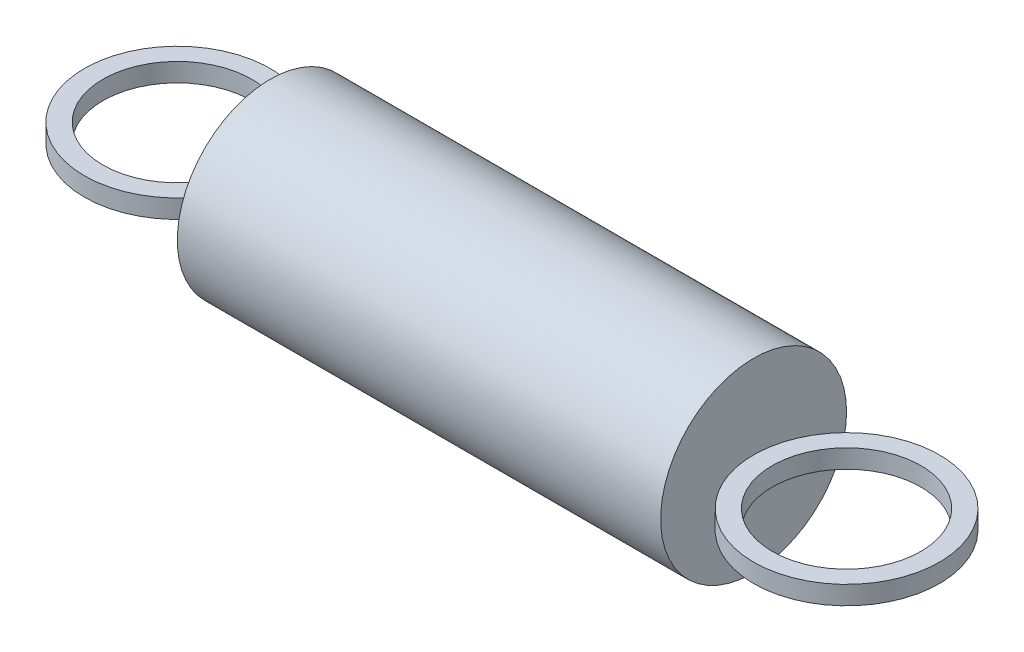
ISO-10303-21;
HEADER;
FILE_DESCRIPTION(('STEP AP214'),'2;1');
FILE_NAME('part.step','',(''),(''),'','','');
FILE_SCHEMA(('AUTOMOTIVE_DESIGN { 1 0 10303 214 1 1 1 1 }'));
ENDSEC;
DATA;
#1=APPLICATION_CONTEXT('core data for automotive mechanical design processes');
#2=APPLICATION_PROTOCOL_DEFINITION('international standard','automotive_design',2000,#1);
#3=PRODUCT_CONTEXT('',#1,'mechanical');
#4=PRODUCT('Part','Part','',(#3));
#5=PRODUCT_RELATED_PRODUCT_CATEGORY('part','',(#4));
#6=PRODUCT_DEFINITION_FORMATION('','',#4);
#7=PRODUCT_DEFINITION_CONTEXT('part definition',#1,'design');
#8=PRODUCT_DEFINITION('design','',#6,#7);
#9=PRODUCT_DEFINITION_SHAPE('','',#8);
#10=(LENGTH_UNIT() NAMED_UNIT(*) SI_UNIT(.MILLI.,.METRE.));
#11=(NAMED_UNIT(*) PLANE_ANGLE_UNIT() SI_UNIT($,.RADIAN.));
#12=(NAMED_UNIT(*) SI_UNIT($,.STERADIAN.) SOLID_ANGLE_UNIT());
#13=UNCERTAINTY_MEASURE_WITH_UNIT(LENGTH_MEASURE(1.E-05),#10,'distance_accuracy_value','');
#14=(GEOMETRIC_REPRESENTATION_CONTEXT(3) GLOBAL_UNCERTAINTY_ASSIGNED_CONTEXT((#13)) GLOBAL_UNIT_ASSIGNED_CONTEXT((#10,
#11,#12)) REPRESENTATION_CONTEXT('',''));
#15=CARTESIAN_POINT('',(0.,0.,0.));
#16=DIRECTION('',(0.,0.,1.));
#17=DIRECTION('',(1.,0.,0.));
#18=AXIS2_PLACEMENT_3D('',#15,#16,#17);
#19=CARTESIAN_POINT('',(24.60625,0.396875,0.));
#20=DIRECTION('',(0.,1.,0.));
#21=DIRECTION('',(0.,0.,1.));
#22=AXIS2_PLACEMENT_3D('',#19,#20,#21);
#23=PLANE('',#22);
#24=CARTESIAN_POINT('',(24.60625,0.396875,0.));
#25=DIRECTION('',(0.,1.,0.));
#26=DIRECTION('',(0.,0.,1.));
#27=AXIS2_PLACEMENT_3D('',#24,#25,#26);
#28=CIRCLE('',#27,3.96875);
#29=CARTESIAN_POINT('',(24.60625,0.396875,3.96875));
#30=VERTEX_POINT('',#29);
#31=EDGE_CURVE('E11',#30,#30,#28,.T.);
#32=ORIENTED_EDGE('',*,*,#31,.T.);
#33=EDGE_LOOP('',(#32));
#34=FACE_BOUND('',#33,.T.);
#35=CARTESIAN_POINT('',(24.60625,0.396875,0.));
#36=DIRECTION('',(0.,1.,0.));
#37=DIRECTION('',(0.,0.,1.));
#38=AXIS2_PLACEMENT_3D('',#35,#36,#37);
#39=CIRCLE('',#38,3.17500000000001);
#40=CARTESIAN_POINT('',(24.60625,0.396875,3.17500000000001));
#41=VERTEX_POINT('',#40);
#42=EDGE_CURVE('E50',#41,#41,#39,.T.);
#43=ORIENTED_EDGE('',*,*,#42,.F.);
#44=EDGE_LOOP('',(#43));
#45=FACE_BOUND('',#44,.T.);
#46=ADVANCED_FACE('F39',(#34,#45),#23,.T.);
#47=CARTESIAN_POINT('',(24.60625,-0.396875,0.));
#48=DIRECTION('',(0.,1.,0.));
#49=DIRECTION('',(0.,0.,1.));
#50=AXIS2_PLACEMENT_3D('',#47,#48,#49);
#51=PLANE('',#50);
#52=CARTESIAN_POINT('',(24.60625,-0.396875,0.));
#53=DIRECTION('',(0.,1.,0.));
#54=DIRECTION('',(0.,0.,1.));
#55=AXIS2_PLACEMENT_3D('',#52,#53,#54);
#56=CIRCLE('',#55,3.96875);
#57=CARTESIAN_POINT('',(24.60625,-0.396875,3.96875));
#58=VERTEX_POINT('',#57);
#59=EDGE_CURVE('E43',#58,#58,#56,.T.);
#60=ORIENTED_EDGE('',*,*,#59,.F.);
#61=EDGE_LOOP('',(#60));
#62=FACE_BOUND('',#61,.T.);
#63=CARTESIAN_POINT('',(24.60625,-0.396875,0.));
#64=DIRECTION('',(0.,1.,0.));
#65=DIRECTION('',(0.,0.,1.));
#66=AXIS2_PLACEMENT_3D('',#63,#64,#65);
#67=CIRCLE('',#66,3.17500000000001);
#68=CARTESIAN_POINT('',(24.60625,-0.396875,3.17500000000001));
#69=VERTEX_POINT('',#68);
#70=EDGE_CURVE('E52',#69,#69,#67,.T.);
#71=ORIENTED_EDGE('',*,*,#70,.T.);
#72=EDGE_LOOP('',(#71));
#73=FACE_BOUND('',#72,.T.);
#74=ADVANCED_FACE('F62',(#62,#73),#51,.F.);
#75=CARTESIAN_POINT('',(24.60625,0.396875,0.));
#76=DIRECTION('',(0.,-1.,0.));
#77=DIRECTION('',(0.,0.,-1.));
#78=AXIS2_PLACEMENT_3D('',#75,#76,#77);
#79=CYLINDRICAL_SURFACE('',#78,3.96875);
#80=ORIENTED_EDGE('',*,*,#31,.F.);
#81=EDGE_LOOP('',(#80));
#82=FACE_BOUND('',#81,.T.);
#83=ORIENTED_EDGE('',*,*,#59,.T.);
#84=EDGE_LOOP('',(#83));
#85=FACE_BOUND('',#84,.T.);
#86=ADVANCED_FACE('F41',(#82,#85),#79,.T.);
#87=CARTESIAN_POINT('',(24.60625,0.396875,0.));
#88=DIRECTION('',(0.,-1.,0.));
#89=DIRECTION('',(0.,0.,-1.));
#90=AXIS2_PLACEMENT_3D('',#87,#88,#89);
#91=CYLINDRICAL_SURFACE('',#90,3.17500000000001);
#92=ORIENTED_EDGE('',*,*,#42,.T.);
#93=EDGE_LOOP('',(#92));
#94=FACE_BOUND('',#93,.T.);
#95=ORIENTED_EDGE('',*,*,#70,.F.);
#96=EDGE_LOOP('',(#95));
#97=FACE_BOUND('',#96,.T.);
#98=ADVANCED_FACE('F58',(#94,#97),#91,.F.);
#99=CLOSED_SHELL('',(#46,#74,#86,#98));
#100=MANIFOLD_SOLID_BREP('B2',#99);
#101=CARTESIAN_POINT('',(-3.96875,0.396875,0.));
#102=DIRECTION('',(0.,1.,0.));
#103=DIRECTION('',(0.,0.,1.));
#104=AXIS2_PLACEMENT_3D('',#101,#102,#103);
#105=PLANE('',#104);
#106=CARTESIAN_POINT('',(-3.96875,0.396875,0.));
#107=DIRECTION('',(0.,1.,0.));
#108=DIRECTION('',(0.,0.,1.));
#109=AXIS2_PLACEMENT_3D('',#106,#107,#108);
#110=CIRCLE('',#109,3.96875);
#111=CARTESIAN_POINT('',(-3.96875,0.396875,3.96875));
#112=VERTEX_POINT('',#111);
#113=EDGE_CURVE('E38',#112,#112,#110,.T.);
#114=ORIENTED_EDGE('',*,*,#113,.T.);
#115=EDGE_LOOP('',(#114));
#116=FACE_BOUND('',#115,.T.);
#117=CARTESIAN_POINT('',(-3.96875,0.396875,0.));
#118=DIRECTION('',(0.,1.,0.));
#119=DIRECTION('',(0.,0.,1.));
#120=AXIS2_PLACEMENT_3D('',#117,#118,#119);
#121=CIRCLE('',#120,3.175);
#122=CARTESIAN_POINT('',(-3.96875,0.396875,3.175));
#123=VERTEX_POINT('',#122);
#124=EDGE_CURVE('E118',#123,#123,#121,.T.);
#125=ORIENTED_EDGE('',*,*,#124,.F.);
#126=EDGE_LOOP('',(#125));
#127=FACE_BOUND('',#126,.T.);
#128=ADVANCED_FACE('F107',(#116,#127),#105,.T.);
#129=CARTESIAN_POINT('',(-3.96875,-0.396875,0.));
#130=DIRECTION('',(0.,1.,0.));
#131=DIRECTION('',(0.,0.,1.));
#132=AXIS2_PLACEMENT_3D('',#129,#130,#131);
#133=PLANE('',#132);
#134=CARTESIAN_POINT('',(-3.96875,-0.396875,0.));
#135=DIRECTION('',(0.,1.,0.));
#136=DIRECTION('',(0.,0.,1.));
#137=AXIS2_PLACEMENT_3D('',#134,#135,#136);
#138=CIRCLE('',#137,3.96875);
#139=CARTESIAN_POINT('',(-3.96875,-0.396875,3.96875));
#140=VERTEX_POINT('',#139);
#141=EDGE_CURVE('E111',#140,#140,#138,.T.);
#142=ORIENTED_EDGE('',*,*,#141,.F.);
#143=EDGE_LOOP('',(#142));
#144=FACE_BOUND('',#143,.T.);
#145=CARTESIAN_POINT('',(-3.96875,-0.396875,0.));
#146=DIRECTION('',(0.,1.,0.));
#147=DIRECTION('',(0.,0.,1.));
#148=AXIS2_PLACEMENT_3D('',#145,#146,#147);
#149=CIRCLE('',#148,3.175);
#150=CARTESIAN_POINT('',(-3.96875,-0.396875,3.175));
#151=VERTEX_POINT('',#150);
#152=EDGE_CURVE('E120',#151,#151,#149,.T.);
#153=ORIENTED_EDGE('',*,*,#152,.T.);
#154=EDGE_LOOP('',(#153));
#155=FACE_BOUND('',#154,.T.);
#156=ADVANCED_FACE('F130',(#144,#155),#133,.F.);
#157=CARTESIAN_POINT('',(-3.96875,0.396875,0.));
#158=DIRECTION('',(0.,-1.,0.));
#159=DIRECTION('',(0.,0.,-1.));
#160=AXIS2_PLACEMENT_3D('',#157,#158,#159);
#161=CYLINDRICAL_SURFACE('',#160,3.96875);
#162=ORIENTED_EDGE('',*,*,#113,.F.);
#163=EDGE_LOOP('',(#162));
#164=FACE_BOUND('',#163,.T.);
#165=ORIENTED_EDGE('',*,*,#141,.T.);
#166=EDGE_LOOP('',(#165));
#167=FACE_BOUND('',#166,.T.);
#168=ADVANCED_FACE('F109',(#164,#167),#161,.T.);
#169=CARTESIAN_POINT('',(-3.96875,0.396875,0.));
#170=DIRECTION('',(0.,-1.,0.));
#171=DIRECTION('',(0.,0.,-1.));
#172=AXIS2_PLACEMENT_3D('',#169,#170,#171);
#173=CYLINDRICAL_SURFACE('',#172,3.175);
#174=ORIENTED_EDGE('',*,*,#124,.T.);
#175=EDGE_LOOP('',(#174));
#176=FACE_BOUND('',#175,.T.);
#177=ORIENTED_EDGE('',*,*,#152,.F.);
#178=EDGE_LOOP('',(#177));
#179=FACE_BOUND('',#178,.T.);
#180=ADVANCED_FACE('F126',(#176,#179),#173,.F.);
#181=CLOSED_SHELL('',(#128,#156,#168,#180));
#182=MANIFOLD_SOLID_BREP('B6',#181);
#183=CARTESIAN_POINT('',(20.6375,0.,0.));
#184=DIRECTION('',(-1.,0.,0.));
#185=DIRECTION('',(0.,0.,1.));
#186=AXIS2_PLACEMENT_3D('',#183,#184,#185);
#187=CYLINDRICAL_SURFACE('',#186,3.96875);
#188=CARTESIAN_POINT('',(20.6375,0.,0.));
#189=DIRECTION('',(1.,0.,0.));
#190=DIRECTION('',(0.,0.,-1.));
#191=AXIS2_PLACEMENT_3D('',#188,#189,#190);
#192=CIRCLE('',#191,3.96875);
#193=CARTESIAN_POINT('',(20.6375,0.,-3.96875));
#194=VERTEX_POINT('',#193);
#195=EDGE_CURVE('E106',#194,#194,#192,.T.);
#196=ORIENTED_EDGE('',*,*,#195,.F.);
#197=EDGE_LOOP('',(#196));
#198=FACE_BOUND('',#197,.T.);
#199=CARTESIAN_POINT('',(0.,0.,0.));
#200=DIRECTION('',(1.,0.,0.));
#201=DIRECTION('',(0.,0.,-1.));
#202=AXIS2_PLACEMENT_3D('',#199,#200,#201);
#203=CIRCLE('',#202,3.96875);
#204=CARTESIAN_POINT('',(0.,0.,-3.96875));
#205=VERTEX_POINT('',#204);
#206=EDGE_CURVE('E171',#205,#205,#203,.T.);
#207=ORIENTED_EDGE('',*,*,#206,.T.);
#208=EDGE_LOOP('',(#207));
#209=FACE_BOUND('',#208,.T.);
#210=ADVANCED_FACE('F168',(#198,#209),#187,.T.);
#211=CARTESIAN_POINT('',(20.6375,0.,0.));
#212=DIRECTION('',(1.,0.,0.));
#213=DIRECTION('',(0.,0.,-1.));
#214=AXIS2_PLACEMENT_3D('',#211,#212,#213);
#215=PLANE('',#214);
#216=ORIENTED_EDGE('',*,*,#195,.T.);
#217=EDGE_LOOP('',(#216));
#218=FACE_BOUND('',#217,.T.);
#219=ADVANCED_FACE('F183',(#218),#215,.T.);
#220=CARTESIAN_POINT('',(0.,0.,0.));
#221=DIRECTION('',(1.,0.,0.));
#222=DIRECTION('',(0.,0.,-1.));
#223=AXIS2_PLACEMENT_3D('',#220,#221,#222);
#224=PLANE('',#223);
#225=ORIENTED_EDGE('',*,*,#206,.F.);
#226=EDGE_LOOP('',(#225));
#227=FACE_BOUND('',#226,.T.);
#228=ADVANCED_FACE('F181',(#227),#224,.F.);
#229=CLOSED_SHELL('',(#210,#219,#228));
#230=MANIFOLD_SOLID_BREP('B33',#229);
#231=ADVANCED_BREP_SHAPE_REPRESENTATION('',(#18,#100,#182,#230),#14);
#232=SHAPE_DEFINITION_REPRESENTATION(#9,#231);
ENDSEC;
END-ISO-10303-21;
